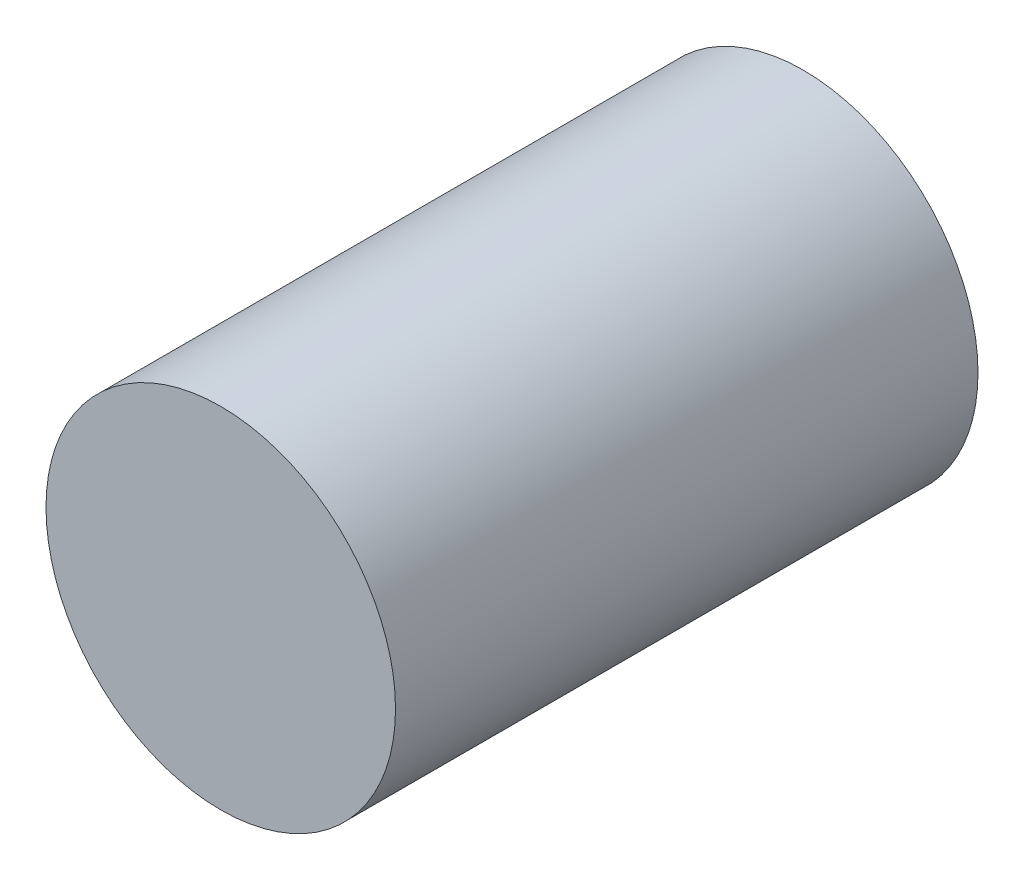
ISO-10303-21;
HEADER;
FILE_DESCRIPTION(('STEP AP214'),'2;1');
FILE_NAME('part.step','',(''),(''),'','','');
FILE_SCHEMA(('AUTOMOTIVE_DESIGN { 1 0 10303 214 1 1 1 1 }'));
ENDSEC;
DATA;
#1=APPLICATION_CONTEXT('core data for automotive mechanical design processes');
#2=APPLICATION_PROTOCOL_DEFINITION('international standard','automotive_design',2000,#1);
#3=PRODUCT_CONTEXT('',#1,'mechanical');
#4=PRODUCT('Part','Part','',(#3));
#5=PRODUCT_RELATED_PRODUCT_CATEGORY('part','',(#4));
#6=PRODUCT_DEFINITION_FORMATION('','',#4);
#7=PRODUCT_DEFINITION_CONTEXT('part definition',#1,'design');
#8=PRODUCT_DEFINITION('design','',#6,#7);
#9=PRODUCT_DEFINITION_SHAPE('','',#8);
#10=(LENGTH_UNIT() NAMED_UNIT(*) SI_UNIT(.MILLI.,.METRE.));
#11=(NAMED_UNIT(*) PLANE_ANGLE_UNIT() SI_UNIT($,.RADIAN.));
#12=(NAMED_UNIT(*) SI_UNIT($,.STERADIAN.) SOLID_ANGLE_UNIT());
#13=UNCERTAINTY_MEASURE_WITH_UNIT(LENGTH_MEASURE(1.E-05),#10,'distance_accuracy_value','');
#14=(GEOMETRIC_REPRESENTATION_CONTEXT(3) GLOBAL_UNCERTAINTY_ASSIGNED_CONTEXT((#13)) GLOBAL_UNIT_ASSIGNED_CONTEXT((#10,
#11,#12)) REPRESENTATION_CONTEXT('',''));
#15=CARTESIAN_POINT('',(0.,0.,0.));
#16=DIRECTION('',(0.,0.,1.));
#17=DIRECTION('',(1.,0.,0.));
#18=AXIS2_PLACEMENT_3D('',#15,#16,#17);
#19=CARTESIAN_POINT('',(0.,0.,30.));
#20=DIRECTION('',(0.,0.,-1.));
#21=DIRECTION('',(-1.,0.,0.));
#22=AXIS2_PLACEMENT_3D('',#19,#20,#21);
#23=CYLINDRICAL_SURFACE('',#22,9.);
#24=CARTESIAN_POINT('',(0.,0.,30.));
#25=DIRECTION('',(0.,0.,1.));
#26=DIRECTION('',(1.,0.,0.));
#27=AXIS2_PLACEMENT_3D('',#24,#25,#26);
#28=CIRCLE('',#27,9.);
#29=CARTESIAN_POINT('',(9.,0.,30.));
#30=VERTEX_POINT('',#29);
#31=EDGE_CURVE('E10',#30,#30,#28,.T.);
#32=ORIENTED_EDGE('',*,*,#31,.F.);
#33=EDGE_LOOP('',(#32));
#34=FACE_BOUND('',#33,.T.);
#35=CARTESIAN_POINT('',(0.,0.,0.));
#36=DIRECTION('',(0.,0.,1.));
#37=DIRECTION('',(1.,0.,0.));
#38=AXIS2_PLACEMENT_3D('',#35,#36,#37);
#39=CIRCLE('',#38,9.);
#40=CARTESIAN_POINT('',(9.,0.,0.));
#41=VERTEX_POINT('',#40);
#42=EDGE_CURVE('E33',#41,#41,#39,.T.);
#43=ORIENTED_EDGE('',*,*,#42,.T.);
#44=EDGE_LOOP('',(#43));
#45=FACE_BOUND('',#44,.T.);
#46=ADVANCED_FACE('F30',(#34,#45),#23,.T.);
#47=CARTESIAN_POINT('',(0.,0.,30.));
#48=DIRECTION('',(0.,0.,1.));
#49=DIRECTION('',(1.,0.,0.));
#50=AXIS2_PLACEMENT_3D('',#47,#48,#49);
#51=PLANE('',#50);
#52=ORIENTED_EDGE('',*,*,#31,.T.);
#53=EDGE_LOOP('',(#52));
#54=FACE_BOUND('',#53,.T.);
#55=ADVANCED_FACE('F45',(#54),#51,.T.);
#56=CARTESIAN_POINT('',(0.,0.,0.));
#57=DIRECTION('',(0.,0.,1.));
#58=DIRECTION('',(1.,0.,0.));
#59=AXIS2_PLACEMENT_3D('',#56,#57,#58);
#60=PLANE('',#59);
#61=ORIENTED_EDGE('',*,*,#42,.F.);
#62=EDGE_LOOP('',(#61));
#63=FACE_BOUND('',#62,.T.);
#64=ADVANCED_FACE('F43',(#63),#60,.F.);
#65=CLOSED_SHELL('',(#46,#55,#64));
#66=MANIFOLD_SOLID_BREP('B2',#65);
#67=ADVANCED_BREP_SHAPE_REPRESENTATION('',(#18,#66),#14);
#68=SHAPE_DEFINITION_REPRESENTATION(#9,#67);
ENDSEC;
END-ISO-10303-21;
